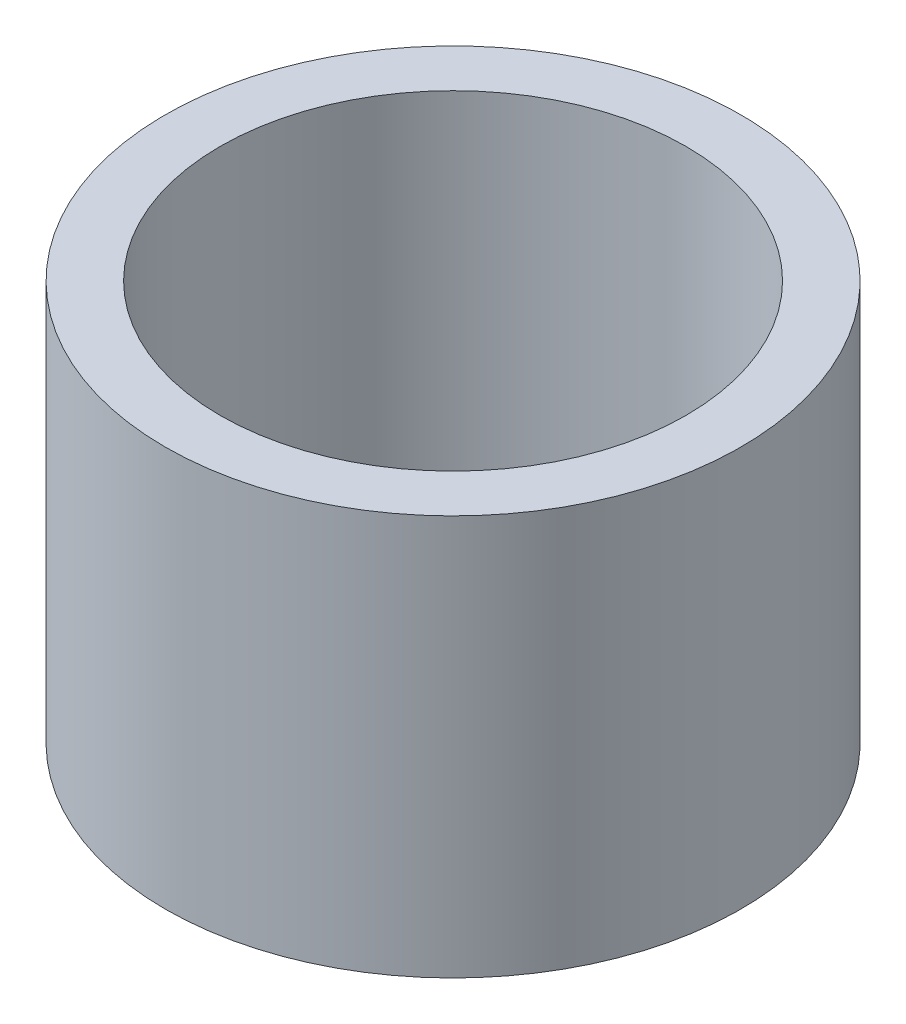
ISO-10303-21;
HEADER;
FILE_DESCRIPTION(('STEP AP214'),'2;1');
FILE_NAME('part.step','',(''),(''),'','','');
FILE_SCHEMA(('AUTOMOTIVE_DESIGN { 1 0 10303 214 1 1 1 1 }'));
ENDSEC;
DATA;
#1=APPLICATION_CONTEXT('core data for automotive mechanical design processes');
#2=APPLICATION_PROTOCOL_DEFINITION('international standard','automotive_design',2000,#1);
#3=PRODUCT_CONTEXT('',#1,'mechanical');
#4=PRODUCT('Part','Part','',(#3));
#5=PRODUCT_RELATED_PRODUCT_CATEGORY('part','',(#4));
#6=PRODUCT_DEFINITION_FORMATION('','',#4);
#7=PRODUCT_DEFINITION_CONTEXT('part definition',#1,'design');
#8=PRODUCT_DEFINITION('design','',#6,#7);
#9=PRODUCT_DEFINITION_SHAPE('','',#8);
#10=(LENGTH_UNIT() NAMED_UNIT(*) SI_UNIT(.MILLI.,.METRE.));
#11=(NAMED_UNIT(*) PLANE_ANGLE_UNIT() SI_UNIT($,.RADIAN.));
#12=(NAMED_UNIT(*) SI_UNIT($,.STERADIAN.) SOLID_ANGLE_UNIT());
#13=UNCERTAINTY_MEASURE_WITH_UNIT(LENGTH_MEASURE(1.E-05),#10,'distance_accuracy_value','');
#14=(GEOMETRIC_REPRESENTATION_CONTEXT(3) GLOBAL_UNCERTAINTY_ASSIGNED_CONTEXT((#13)) GLOBAL_UNIT_ASSIGNED_CONTEXT((#10,
#11,#12)) REPRESENTATION_CONTEXT('',''));
#15=CARTESIAN_POINT('',(0.,0.,0.));
#16=DIRECTION('',(0.,0.,1.));
#17=DIRECTION('',(1.,0.,0.));
#18=AXIS2_PLACEMENT_3D('',#15,#16,#17);
#19=CARTESIAN_POINT('',(0.,14.6,0.));
#20=DIRECTION('',(0.,-1.,0.));
#21=DIRECTION('',(0.,0.,-1.));
#22=AXIS2_PLACEMENT_3D('',#19,#20,#21);
#23=CYLINDRICAL_SURFACE('',#22,10.5);
#24=CARTESIAN_POINT('',(0.,14.6,0.));
#25=DIRECTION('',(0.,1.,0.));
#26=DIRECTION('',(0.,0.,1.));
#27=AXIS2_PLACEMENT_3D('',#24,#25,#26);
#28=CIRCLE('',#27,10.5);
#29=CARTESIAN_POINT('',(0.,14.6,10.5));
#30=VERTEX_POINT('',#29);
#31=EDGE_CURVE('E10',#30,#30,#28,.T.);
#32=ORIENTED_EDGE('',*,*,#31,.F.);
#33=EDGE_LOOP('',(#32));
#34=FACE_BOUND('',#33,.T.);
#35=CARTESIAN_POINT('',(0.,0.,0.));
#36=DIRECTION('',(0.,1.,0.));
#37=DIRECTION('',(0.,0.,1.));
#38=AXIS2_PLACEMENT_3D('',#35,#36,#37);
#39=CIRCLE('',#38,10.5);
#40=CARTESIAN_POINT('',(0.,0.,10.5));
#41=VERTEX_POINT('',#40);
#42=EDGE_CURVE('E46',#41,#41,#39,.T.);
#43=ORIENTED_EDGE('',*,*,#42,.T.);
#44=EDGE_LOOP('',(#43));
#45=FACE_BOUND('',#44,.T.);
#46=ADVANCED_FACE('F43',(#34,#45),#23,.T.);
#47=CARTESIAN_POINT('',(0.,14.6,0.));
#48=DIRECTION('',(0.,1.,0.));
#49=DIRECTION('',(0.,0.,1.));
#50=AXIS2_PLACEMENT_3D('',#47,#48,#49);
#51=PLANE('',#50);
#52=CARTESIAN_POINT('',(0.,14.6,0.));
#53=DIRECTION('',(0.,1.,0.));
#54=DIRECTION('',(0.,0.,1.));
#55=AXIS2_PLACEMENT_3D('',#52,#53,#54);
#56=CIRCLE('',#55,8.5);
#57=CARTESIAN_POINT('',(0.,14.6,8.5));
#58=VERTEX_POINT('',#57);
#59=EDGE_CURVE('E57',#58,#58,#56,.T.);
#60=ORIENTED_EDGE('',*,*,#59,.F.);
#61=EDGE_LOOP('',(#60));
#62=FACE_BOUND('',#61,.T.);
#63=ORIENTED_EDGE('',*,*,#31,.T.);
#64=EDGE_LOOP('',(#63));
#65=FACE_BOUND('',#64,.T.);
#66=ADVANCED_FACE('F74',(#62,#65),#51,.T.);
#67=CARTESIAN_POINT('',(0.,0.,0.));
#68=DIRECTION('',(0.,1.,0.));
#69=DIRECTION('',(0.,0.,1.));
#70=AXIS2_PLACEMENT_3D('',#67,#68,#69);
#71=PLANE('',#70);
#72=CARTESIAN_POINT('',(0.,0.,0.));
#73=DIRECTION('',(0.,1.,0.));
#74=DIRECTION('',(0.,0.,1.));
#75=AXIS2_PLACEMENT_3D('',#72,#73,#74);
#76=CIRCLE('',#75,8.5);
#77=CARTESIAN_POINT('',(0.,0.,8.5));
#78=VERTEX_POINT('',#77);
#79=EDGE_CURVE('E55',#78,#78,#76,.T.);
#80=ORIENTED_EDGE('',*,*,#79,.T.);
#81=EDGE_LOOP('',(#80));
#82=FACE_BOUND('',#81,.T.);
#83=ORIENTED_EDGE('',*,*,#42,.F.);
#84=EDGE_LOOP('',(#83));
#85=FACE_BOUND('',#84,.T.);
#86=ADVANCED_FACE('F65',(#82,#85),#71,.F.);
#87=CARTESIAN_POINT('',(0.,0.,0.));
#88=DIRECTION('',(0.,1.,0.));
#89=DIRECTION('',(0.,0.,1.));
#90=AXIS2_PLACEMENT_3D('',#87,#88,#89);
#91=CYLINDRICAL_SURFACE('',#90,8.5);
#92=ORIENTED_EDGE('',*,*,#79,.F.);
#93=EDGE_LOOP('',(#92));
#94=FACE_BOUND('',#93,.T.);
#95=ORIENTED_EDGE('',*,*,#59,.T.);
#96=EDGE_LOOP('',(#95));
#97=FACE_BOUND('',#96,.T.);
#98=ADVANCED_FACE('F68',(#94,#97),#91,.F.);
#99=CLOSED_SHELL('',(#46,#66,#86,#98));
#100=MANIFOLD_SOLID_BREP('B2',#99);
#101=ADVANCED_BREP_SHAPE_REPRESENTATION('',(#18,#100),#14);
#102=SHAPE_DEFINITION_REPRESENTATION(#9,#101);
ENDSEC;
END-ISO-10303-21;
